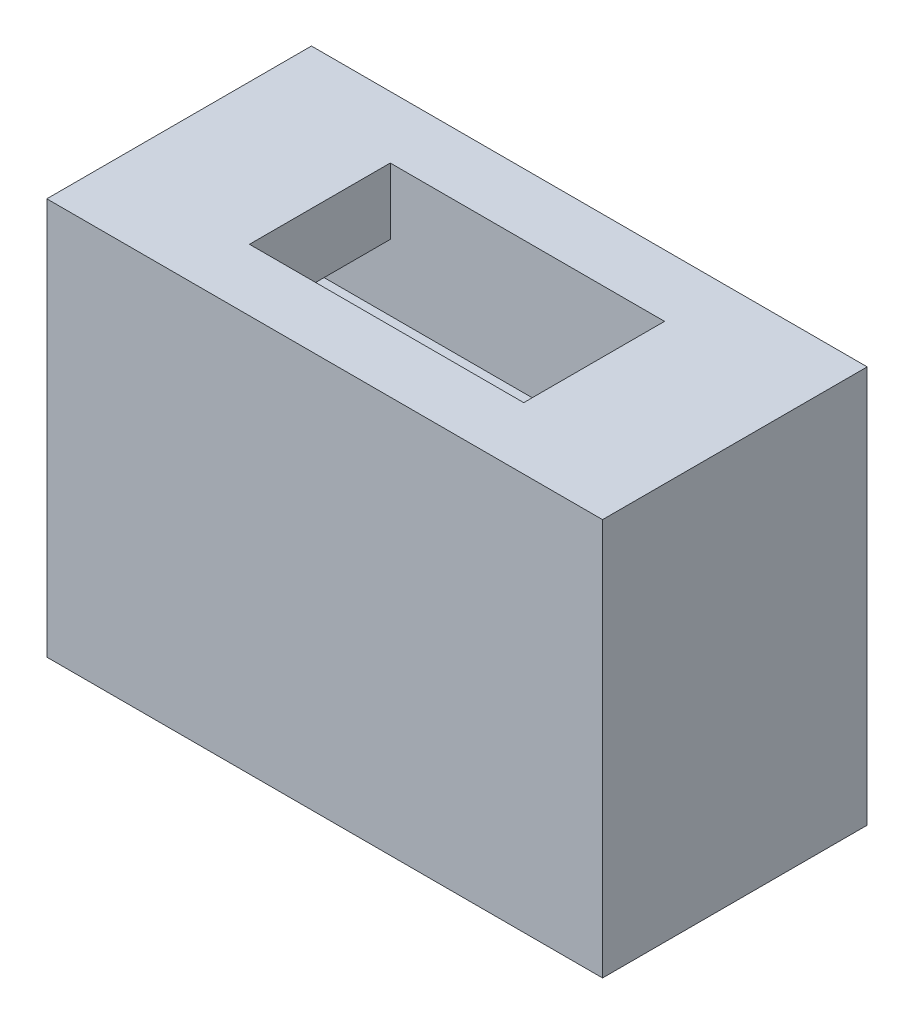
ISO-10303-21;
HEADER;
FILE_DESCRIPTION(('STEP AP214'),'2;1');
FILE_NAME('part.step','',(''),(''),'','','');
FILE_SCHEMA(('AUTOMOTIVE_DESIGN { 1 0 10303 214 1 1 1 1 }'));
ENDSEC;
DATA;
#1=APPLICATION_CONTEXT('core data for automotive mechanical design processes');
#2=APPLICATION_PROTOCOL_DEFINITION('international standard','automotive_design',2000,#1);
#3=PRODUCT_CONTEXT('',#1,'mechanical');
#4=PRODUCT('Part','Part','',(#3));
#5=PRODUCT_RELATED_PRODUCT_CATEGORY('part','',(#4));
#6=PRODUCT_DEFINITION_FORMATION('','',#4);
#7=PRODUCT_DEFINITION_CONTEXT('part definition',#1,'design');
#8=PRODUCT_DEFINITION('design','',#6,#7);
#9=PRODUCT_DEFINITION_SHAPE('','',#8);
#10=(LENGTH_UNIT() NAMED_UNIT(*) SI_UNIT(.MILLI.,.METRE.));
#11=(NAMED_UNIT(*) PLANE_ANGLE_UNIT() SI_UNIT($,.RADIAN.));
#12=(NAMED_UNIT(*) SI_UNIT($,.STERADIAN.) SOLID_ANGLE_UNIT());
#13=UNCERTAINTY_MEASURE_WITH_UNIT(LENGTH_MEASURE(1.E-05),#10,'distance_accuracy_value','');
#14=(GEOMETRIC_REPRESENTATION_CONTEXT(3) GLOBAL_UNCERTAINTY_ASSIGNED_CONTEXT((#13)) GLOBAL_UNIT_ASSIGNED_CONTEXT((#10,
#11,#12)) REPRESENTATION_CONTEXT('',''));
#15=CARTESIAN_POINT('',(0.,0.,0.));
#16=DIRECTION('',(0.,0.,1.));
#17=DIRECTION('',(1.,0.,0.));
#18=AXIS2_PLACEMENT_3D('',#15,#16,#17);
#19=CARTESIAN_POINT('',(21.,30.,-10.));
#20=DIRECTION('',(-1.,0.,0.));
#21=DIRECTION('',(0.,0.,1.));
#22=AXIS2_PLACEMENT_3D('',#19,#20,#21);
#23=PLANE('',#22);
#24=DIRECTION('',(0.,0.,-1.));
#25=VECTOR('',#24,1.);
#26=CARTESIAN_POINT('',(21.,0.,-10.));
#27=LINE('',#26,#25);
#28=CARTESIAN_POINT('',(21.,0.,10.));
#29=VERTEX_POINT('',#28);
#30=CARTESIAN_POINT('',(21.,0.,-10.));
#31=VERTEX_POINT('',#30);
#32=EDGE_CURVE('E160',#29,#31,#27,.T.);
#33=ORIENTED_EDGE('',*,*,#32,.T.);
#34=DIRECTION('',(0.,-1.,0.));
#35=VECTOR('',#34,1.);
#36=CARTESIAN_POINT('',(21.,30.,-10.));
#37=LINE('',#36,#35);
#38=CARTESIAN_POINT('',(21.,30.,-10.));
#39=VERTEX_POINT('',#38);
#40=EDGE_CURVE('E11',#39,#31,#37,.T.);
#41=ORIENTED_EDGE('',*,*,#40,.F.);
#42=DIRECTION('',(0.,0.,-1.));
#43=VECTOR('',#42,1.);
#44=CARTESIAN_POINT('',(21.,30.,-10.));
#45=LINE('',#44,#43);
#46=CARTESIAN_POINT('',(21.,30.,10.));
#47=VERTEX_POINT('',#46);
#48=EDGE_CURVE('E166',#47,#39,#45,.T.);
#49=ORIENTED_EDGE('',*,*,#48,.F.);
#50=DIRECTION('',(0.,-1.,0.));
#51=VECTOR('',#50,1.);
#52=CARTESIAN_POINT('',(21.,30.,10.));
#53=LINE('',#52,#51);
#54=EDGE_CURVE('E176',#47,#29,#53,.T.);
#55=ORIENTED_EDGE('',*,*,#54,.T.);
#56=EDGE_LOOP('',(#33,#41,#49,#55));
#57=FACE_BOUND('',#56,.T.);
#58=ADVANCED_FACE('F37',(#57),#23,.F.);
#59=CARTESIAN_POINT('',(-21.,30.,-10.));
#60=DIRECTION('',(0.,0.,1.));
#61=DIRECTION('',(1.,0.,0.));
#62=AXIS2_PLACEMENT_3D('',#59,#60,#61);
#63=PLANE('',#62);
#64=DIRECTION('',(-1.,0.,0.));
#65=VECTOR('',#64,1.);
#66=CARTESIAN_POINT('',(-21.,0.,-10.));
#67=LINE('',#66,#65);
#68=CARTESIAN_POINT('',(-21.,0.,-10.));
#69=VERTEX_POINT('',#68);
#70=EDGE_CURVE('E179',#31,#69,#67,.T.);
#71=ORIENTED_EDGE('',*,*,#70,.T.);
#72=DIRECTION('',(0.,-1.,0.));
#73=VECTOR('',#72,1.);
#74=CARTESIAN_POINT('',(-21.,30.,-10.));
#75=LINE('',#74,#73);
#76=CARTESIAN_POINT('',(-21.,30.,-10.));
#77=VERTEX_POINT('',#76);
#78=EDGE_CURVE('E44',#77,#69,#75,.T.);
#79=ORIENTED_EDGE('',*,*,#78,.F.);
#80=DIRECTION('',(-1.,0.,0.));
#81=VECTOR('',#80,1.);
#82=CARTESIAN_POINT('',(-21.,30.,-10.));
#83=LINE('',#82,#81);
#84=EDGE_CURVE('E169',#39,#77,#83,.T.);
#85=ORIENTED_EDGE('',*,*,#84,.F.);
#86=ORIENTED_EDGE('',*,*,#40,.T.);
#87=EDGE_LOOP('',(#71,#79,#85,#86));
#88=FACE_BOUND('',#87,.T.);
#89=ADVANCED_FACE('F207',(#88),#63,.F.);
#90=CARTESIAN_POINT('',(-21.,30.,-10.));
#91=DIRECTION('',(1.,0.,0.));
#92=DIRECTION('',(0.,0.,-1.));
#93=AXIS2_PLACEMENT_3D('',#90,#91,#92);
#94=PLANE('',#93);
#95=DIRECTION('',(0.,0.,1.));
#96=VECTOR('',#95,1.);
#97=CARTESIAN_POINT('',(-21.,25.,5.32015240338215));
#98=LINE('',#97,#96);
#99=CARTESIAN_POINT('',(-21.,25.,-5.32015240338215));
#100=VERTEX_POINT('',#99);
#101=CARTESIAN_POINT('',(-21.,25.,5.32015240338215));
#102=VERTEX_POINT('',#101);
#103=EDGE_CURVE('E135',#100,#102,#98,.T.);
#104=ORIENTED_EDGE('',*,*,#103,.T.);
#105=DIRECTION('',(0.,-1.,0.));
#106=VECTOR('',#105,1.);
#107=CARTESIAN_POINT('',(-21.,20.,5.32015240338215));
#108=LINE('',#107,#106);
#109=CARTESIAN_POINT('',(-21.,20.,5.32015240338215));
#110=VERTEX_POINT('',#109);
#111=EDGE_CURVE('E119',#102,#110,#108,.T.);
#112=ORIENTED_EDGE('',*,*,#111,.T.);
#113=DIRECTION('',(0.,0.,-1.));
#114=VECTOR('',#113,1.);
#115=CARTESIAN_POINT('',(-21.,20.,5.32015240338215));
#116=LINE('',#115,#114);
#117=CARTESIAN_POINT('',(-21.,20.,-5.32015240338215));
#118=VERTEX_POINT('',#117);
#119=EDGE_CURVE('E126',#110,#118,#116,.T.);
#120=ORIENTED_EDGE('',*,*,#119,.T.);
#121=DIRECTION('',(0.,1.,0.));
#122=VECTOR('',#121,1.);
#123=CARTESIAN_POINT('',(-21.,20.,-5.32015240338215));
#124=LINE('',#123,#122);
#125=EDGE_CURVE('E130',#118,#100,#124,.T.);
#126=ORIENTED_EDGE('',*,*,#125,.T.);
#127=EDGE_LOOP('',(#104,#112,#120,#126));
#128=FACE_BOUND('',#127,.T.);
#129=DIRECTION('',(0.,0.,1.));
#130=VECTOR('',#129,1.);
#131=CARTESIAN_POINT('',(-21.,0.,-10.));
#132=LINE('',#131,#130);
#133=CARTESIAN_POINT('',(-21.,0.,10.));
#134=VERTEX_POINT('',#133);
#135=EDGE_CURVE('E181',#69,#134,#132,.T.);
#136=ORIENTED_EDGE('',*,*,#135,.T.);
#137=DIRECTION('',(0.,-1.,0.));
#138=VECTOR('',#137,1.);
#139=CARTESIAN_POINT('',(-21.,30.,10.));
#140=LINE('',#139,#138);
#141=CARTESIAN_POINT('',(-21.,30.,10.));
#142=VERTEX_POINT('',#141);
#143=EDGE_CURVE('E186',#142,#134,#140,.T.);
#144=ORIENTED_EDGE('',*,*,#143,.F.);
#145=DIRECTION('',(0.,0.,1.));
#146=VECTOR('',#145,1.);
#147=CARTESIAN_POINT('',(-21.,30.,-10.));
#148=LINE('',#147,#146);
#149=EDGE_CURVE('E172',#77,#142,#148,.T.);
#150=ORIENTED_EDGE('',*,*,#149,.F.);
#151=ORIENTED_EDGE('',*,*,#78,.T.);
#152=EDGE_LOOP('',(#136,#144,#150,#151));
#153=FACE_BOUND('',#152,.T.);
#154=ADVANCED_FACE('F132',(#128,#153),#94,.F.);
#155=CARTESIAN_POINT('',(-21.,30.,10.));
#156=DIRECTION('',(0.,0.,-1.));
#157=DIRECTION('',(-1.,0.,0.));
#158=AXIS2_PLACEMENT_3D('',#155,#156,#157);
#159=PLANE('',#158);
#160=DIRECTION('',(1.,0.,0.));
#161=VECTOR('',#160,1.);
#162=CARTESIAN_POINT('',(-21.,0.,10.));
#163=LINE('',#162,#161);
#164=EDGE_CURVE('E170',#134,#29,#163,.T.);
#165=ORIENTED_EDGE('',*,*,#164,.T.);
#166=ORIENTED_EDGE('',*,*,#54,.F.);
#167=DIRECTION('',(1.,0.,0.));
#168=VECTOR('',#167,1.);
#169=CARTESIAN_POINT('',(-21.,30.,10.));
#170=LINE('',#169,#168);
#171=EDGE_CURVE('E174',#142,#47,#170,.T.);
#172=ORIENTED_EDGE('',*,*,#171,.F.);
#173=ORIENTED_EDGE('',*,*,#143,.T.);
#174=EDGE_LOOP('',(#165,#166,#172,#173));
#175=FACE_BOUND('',#174,.T.);
#176=ADVANCED_FACE('F200',(#175),#159,.F.);
#177=CARTESIAN_POINT('',(0.,30.,0.));
#178=DIRECTION('',(0.,1.,0.));
#179=DIRECTION('',(0.,0.,1.));
#180=AXIS2_PLACEMENT_3D('',#177,#178,#179);
#181=PLANE('',#180);
#182=DIRECTION('',(0.,0.,-1.));
#183=VECTOR('',#182,1.);
#184=CARTESIAN_POINT('',(10.3645557087797,30.,5.32015240338215));
#185=LINE('',#184,#183);
#186=CARTESIAN_POINT('',(10.3645557087797,30.,5.32015240338215));
#187=VERTEX_POINT('',#186);
#188=CARTESIAN_POINT('',(10.3645557087797,30.,-5.32015240338215));
#189=VERTEX_POINT('',#188);
#190=EDGE_CURVE('E59',#187,#189,#185,.T.);
#191=ORIENTED_EDGE('',*,*,#190,.F.);
#192=DIRECTION('',(1.,0.,0.));
#193=VECTOR('',#192,1.);
#194=CARTESIAN_POINT('',(-10.3645557087797,30.,5.32015240338215));
#195=LINE('',#194,#193);
#196=CARTESIAN_POINT('',(-10.3645557087797,30.,5.32015240338215));
#197=VERTEX_POINT('',#196);
#198=EDGE_CURVE('E149',#197,#187,#195,.T.);
#199=ORIENTED_EDGE('',*,*,#198,.F.);
#200=DIRECTION('',(0.,0.,1.));
#201=VECTOR('',#200,1.);
#202=CARTESIAN_POINT('',(-10.3645557087797,30.,5.32015240338215));
#203=LINE('',#202,#201);
#204=CARTESIAN_POINT('',(-10.3645557087797,30.,-5.32015240338215));
#205=VERTEX_POINT('',#204);
#206=EDGE_CURVE('E155',#205,#197,#203,.T.);
#207=ORIENTED_EDGE('',*,*,#206,.F.);
#208=DIRECTION('',(-1.,0.,0.));
#209=VECTOR('',#208,1.);
#210=CARTESIAN_POINT('',(-10.3645557087797,30.,-5.32015240338215));
#211=LINE('',#210,#209);
#212=EDGE_CURVE('E152',#189,#205,#211,.T.);
#213=ORIENTED_EDGE('',*,*,#212,.F.);
#214=EDGE_LOOP('',(#191,#199,#207,#213));
#215=FACE_BOUND('',#214,.T.);
#216=ORIENTED_EDGE('',*,*,#48,.T.);
#217=ORIENTED_EDGE('',*,*,#84,.T.);
#218=ORIENTED_EDGE('',*,*,#149,.T.);
#219=ORIENTED_EDGE('',*,*,#171,.T.);
#220=EDGE_LOOP('',(#216,#217,#218,#219));
#221=FACE_BOUND('',#220,.T.);
#222=ADVANCED_FACE('F206',(#215,#221),#181,.T.);
#223=CARTESIAN_POINT('',(0.,0.,0.));
#224=DIRECTION('',(0.,1.,0.));
#225=DIRECTION('',(0.,0.,1.));
#226=AXIS2_PLACEMENT_3D('',#223,#224,#225);
#227=PLANE('',#226);
#228=ORIENTED_EDGE('',*,*,#32,.F.);
#229=ORIENTED_EDGE('',*,*,#164,.F.);
#230=ORIENTED_EDGE('',*,*,#135,.F.);
#231=ORIENTED_EDGE('',*,*,#70,.F.);
#232=EDGE_LOOP('',(#228,#229,#230,#231));
#233=FACE_BOUND('',#232,.T.);
#234=ADVANCED_FACE('F197',(#233),#227,.F.);
#235=CARTESIAN_POINT('',(10.3645557087797,20.,5.32015240338215));
#236=DIRECTION('',(1.,0.,0.));
#237=DIRECTION('',(0.,0.,-1.));
#238=AXIS2_PLACEMENT_3D('',#235,#236,#237);
#239=PLANE('',#238);
#240=ORIENTED_EDGE('',*,*,#190,.T.);
#241=DIRECTION('',(0.,1.,0.));
#242=VECTOR('',#241,1.);
#243=CARTESIAN_POINT('',(10.3645557087797,20.,-5.32015240338215));
#244=LINE('',#243,#242);
#245=CARTESIAN_POINT('',(10.3645557087797,20.,-5.32015240338215));
#246=VERTEX_POINT('',#245);
#247=EDGE_CURVE('E123',#246,#189,#244,.T.);
#248=ORIENTED_EDGE('',*,*,#247,.F.);
#249=DIRECTION('',(0.,0.,-1.));
#250=VECTOR('',#249,1.);
#251=CARTESIAN_POINT('',(10.3645557087797,20.,5.32015240338215));
#252=LINE('',#251,#250);
#253=CARTESIAN_POINT('',(10.3645557087797,20.,5.32015240338215));
#254=VERTEX_POINT('',#253);
#255=EDGE_CURVE('E147',#254,#246,#252,.T.);
#256=ORIENTED_EDGE('',*,*,#255,.F.);
#257=DIRECTION('',(0.,1.,0.));
#258=VECTOR('',#257,1.);
#259=CARTESIAN_POINT('',(10.3645557087797,20.,5.32015240338215));
#260=LINE('',#259,#258);
#261=EDGE_CURVE('E121',#254,#187,#260,.T.);
#262=ORIENTED_EDGE('',*,*,#261,.T.);
#263=EDGE_LOOP('',(#240,#248,#256,#262));
#264=FACE_BOUND('',#263,.T.);
#265=ADVANCED_FACE('F219',(#264),#239,.F.);
#266=CARTESIAN_POINT('',(-10.3645557087797,20.,5.32015240338215));
#267=DIRECTION('',(0.,0.,1.));
#268=DIRECTION('',(1.,0.,0.));
#269=AXIS2_PLACEMENT_3D('',#266,#267,#268);
#270=PLANE('',#269);
#271=ORIENTED_EDGE('',*,*,#198,.T.);
#272=ORIENTED_EDGE('',*,*,#261,.F.);
#273=DIRECTION('',(1.,0.,0.));
#274=VECTOR('',#273,1.);
#275=CARTESIAN_POINT('',(-10.3645557087797,20.,5.32015240338215));
#276=LINE('',#275,#274);
#277=EDGE_CURVE('E115',#110,#254,#276,.T.);
#278=ORIENTED_EDGE('',*,*,#277,.F.);
#279=ORIENTED_EDGE('',*,*,#111,.F.);
#280=DIRECTION('',(1.,0.,0.));
#281=VECTOR('',#280,1.);
#282=CARTESIAN_POINT('',(-21.,25.,5.32015240338215));
#283=LINE('',#282,#281);
#284=CARTESIAN_POINT('',(-10.3645557087797,25.,5.32015240338215));
#285=VERTEX_POINT('',#284);
#286=EDGE_CURVE('E144',#102,#285,#283,.T.);
#287=ORIENTED_EDGE('',*,*,#286,.T.);
#288=DIRECTION('',(0.,1.,0.));
#289=VECTOR('',#288,1.);
#290=CARTESIAN_POINT('',(-10.3645557087797,20.,5.32015240338215));
#291=LINE('',#290,#289);
#292=EDGE_CURVE('E161',#285,#197,#291,.T.);
#293=ORIENTED_EDGE('',*,*,#292,.T.);
#294=EDGE_LOOP('',(#271,#272,#278,#279,#287,#293));
#295=FACE_BOUND('',#294,.T.);
#296=ADVANCED_FACE('F117',(#295),#270,.F.);
#297=CARTESIAN_POINT('',(-10.3645557087797,20.,5.32015240338215));
#298=DIRECTION('',(-1.,0.,0.));
#299=DIRECTION('',(0.,0.,1.));
#300=AXIS2_PLACEMENT_3D('',#297,#298,#299);
#301=PLANE('',#300);
#302=ORIENTED_EDGE('',*,*,#292,.F.);
#303=DIRECTION('',(0.,0.,1.));
#304=VECTOR('',#303,1.);
#305=CARTESIAN_POINT('',(-10.3645557087797,25.,5.32015240338215));
#306=LINE('',#305,#304);
#307=CARTESIAN_POINT('',(-10.3645557087797,25.,-5.32015240338215));
#308=VERTEX_POINT('',#307);
#309=EDGE_CURVE('E136',#308,#285,#306,.T.);
#310=ORIENTED_EDGE('',*,*,#309,.F.);
#311=DIRECTION('',(0.,1.,0.));
#312=VECTOR('',#311,1.);
#313=CARTESIAN_POINT('',(-10.3645557087797,20.,-5.32015240338215));
#314=LINE('',#313,#312);
#315=EDGE_CURVE('E163',#308,#205,#314,.T.);
#316=ORIENTED_EDGE('',*,*,#315,.T.);
#317=ORIENTED_EDGE('',*,*,#206,.T.);
#318=EDGE_LOOP('',(#302,#310,#316,#317));
#319=FACE_BOUND('',#318,.T.);
#320=ADVANCED_FACE('F228',(#319),#301,.F.);
#321=CARTESIAN_POINT('',(-10.3645557087797,20.,-5.32015240338215));
#322=DIRECTION('',(0.,0.,-1.));
#323=DIRECTION('',(-1.,0.,0.));
#324=AXIS2_PLACEMENT_3D('',#321,#322,#323);
#325=PLANE('',#324);
#326=ORIENTED_EDGE('',*,*,#212,.T.);
#327=ORIENTED_EDGE('',*,*,#315,.F.);
#328=DIRECTION('',(1.,0.,0.));
#329=VECTOR('',#328,1.);
#330=CARTESIAN_POINT('',(-21.,25.,-5.32015240338215));
#331=LINE('',#330,#329);
#332=EDGE_CURVE('E142',#100,#308,#331,.T.);
#333=ORIENTED_EDGE('',*,*,#332,.F.);
#334=ORIENTED_EDGE('',*,*,#125,.F.);
#335=DIRECTION('',(-1.,0.,0.));
#336=VECTOR('',#335,1.);
#337=CARTESIAN_POINT('',(-10.3645557087797,20.,-5.32015240338215));
#338=LINE('',#337,#336);
#339=EDGE_CURVE('E51',#246,#118,#338,.T.);
#340=ORIENTED_EDGE('',*,*,#339,.F.);
#341=ORIENTED_EDGE('',*,*,#247,.T.);
#342=EDGE_LOOP('',(#326,#327,#333,#334,#340,#341));
#343=FACE_BOUND('',#342,.T.);
#344=ADVANCED_FACE('F225',(#343),#325,.F.);
#345=CARTESIAN_POINT('',(0.,20.,0.));
#346=DIRECTION('',(0.,-1.,0.));
#347=DIRECTION('',(0.,0.,-1.));
#348=AXIS2_PLACEMENT_3D('',#345,#346,#347);
#349=PLANE('',#348);
#350=ORIENTED_EDGE('',*,*,#255,.T.);
#351=ORIENTED_EDGE('',*,*,#339,.T.);
#352=ORIENTED_EDGE('',*,*,#119,.F.);
#353=ORIENTED_EDGE('',*,*,#277,.T.);
#354=EDGE_LOOP('',(#350,#351,#352,#353));
#355=FACE_BOUND('',#354,.T.);
#356=ADVANCED_FACE('F127',(#355),#349,.F.);
#357=CARTESIAN_POINT('',(-21.,25.,5.32015240338215));
#358=DIRECTION('',(0.,1.,0.));
#359=DIRECTION('',(0.,0.,1.));
#360=AXIS2_PLACEMENT_3D('',#357,#358,#359);
#361=PLANE('',#360);
#362=ORIENTED_EDGE('',*,*,#309,.T.);
#363=ORIENTED_EDGE('',*,*,#286,.F.);
#364=ORIENTED_EDGE('',*,*,#103,.F.);
#365=ORIENTED_EDGE('',*,*,#332,.T.);
#366=EDGE_LOOP('',(#362,#363,#364,#365));
#367=FACE_BOUND('',#366,.T.);
#368=ADVANCED_FACE('F237',(#367),#361,.F.);
#369=CLOSED_SHELL('',(#58,#89,#154,#176,#222,#234,#265,#296,#320,#344,#356,#368));
#370=MANIFOLD_SOLID_BREP('B2',#369);
#371=ADVANCED_BREP_SHAPE_REPRESENTATION('',(#18,#370),#14);
#372=SHAPE_DEFINITION_REPRESENTATION(#9,#371);
ENDSEC;
END-ISO-10303-21;
